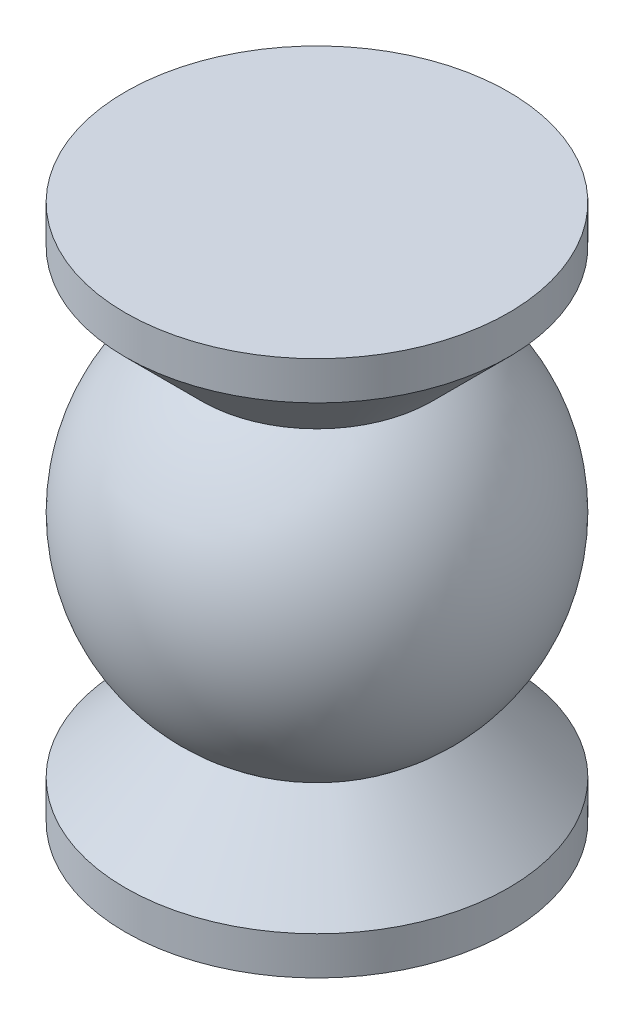
ISO-10303-21;
HEADER;
FILE_DESCRIPTION(('STEP AP214'),'2;1');
FILE_NAME('part.step','',(''),(''),'','','');
FILE_SCHEMA(('AUTOMOTIVE_DESIGN { 1 0 10303 214 1 1 1 1 }'));
ENDSEC;
DATA;
#1=APPLICATION_CONTEXT('core data for automotive mechanical design processes');
#2=APPLICATION_PROTOCOL_DEFINITION('international standard','automotive_design',2000,#1);
#3=PRODUCT_CONTEXT('',#1,'mechanical');
#4=PRODUCT('Part','Part','',(#3));
#5=PRODUCT_RELATED_PRODUCT_CATEGORY('part','',(#4));
#6=PRODUCT_DEFINITION_FORMATION('','',#4);
#7=PRODUCT_DEFINITION_CONTEXT('part definition',#1,'design');
#8=PRODUCT_DEFINITION('design','',#6,#7);
#9=PRODUCT_DEFINITION_SHAPE('','',#8);
#10=(LENGTH_UNIT() NAMED_UNIT(*) SI_UNIT(.MILLI.,.METRE.));
#11=(NAMED_UNIT(*) PLANE_ANGLE_UNIT() SI_UNIT($,.RADIAN.));
#12=(NAMED_UNIT(*) SI_UNIT($,.STERADIAN.) SOLID_ANGLE_UNIT());
#13=UNCERTAINTY_MEASURE_WITH_UNIT(LENGTH_MEASURE(1.E-05),#10,'distance_accuracy_value','');
#14=(GEOMETRIC_REPRESENTATION_CONTEXT(3) GLOBAL_UNCERTAINTY_ASSIGNED_CONTEXT((#13)) GLOBAL_UNIT_ASSIGNED_CONTEXT((#10,
#11,#12)) REPRESENTATION_CONTEXT('',''));
#15=CARTESIAN_POINT('',(0.,0.,0.));
#16=DIRECTION('',(0.,0.,1.));
#17=DIRECTION('',(1.,0.,0.));
#18=AXIS2_PLACEMENT_3D('',#15,#16,#17);
#19=CARTESIAN_POINT('',(0.,35.,0.));
#20=DIRECTION('',(0.,-1.,0.));
#21=DIRECTION('',(0.,0.,-1.));
#22=AXIS2_PLACEMENT_3D('',#19,#20,#21);
#23=PLANE('',#22);
#24=CARTESIAN_POINT('',(0.,35.,0.));
#25=DIRECTION('',(0.,1.,0.));
#26=DIRECTION('',(0.,0.,1.));
#27=AXIS2_PLACEMENT_3D('',#24,#25,#26);
#28=CIRCLE('',#27,25.);
#29=CARTESIAN_POINT('',(0.,35.,25.));
#30=VERTEX_POINT('',#29);
#31=EDGE_CURVE('E10',#30,#30,#28,.T.);
#32=ORIENTED_EDGE('',*,*,#31,.T.);
#33=EDGE_LOOP('',(#32));
#34=FACE_BOUND('',#33,.T.);
#35=ADVANCED_FACE('F41',(#34),#23,.F.);
#36=CARTESIAN_POINT('',(0.,52.3742990344634,0.));
#37=DIRECTION('',(0.,1.,0.));
#38=DIRECTION('',(0.,0.,1.));
#39=AXIS2_PLACEMENT_3D('',#36,#37,#38);
#40=CYLINDRICAL_SURFACE('',#39,25.);
#41=ORIENTED_EDGE('',*,*,#31,.F.);
#42=EDGE_LOOP('',(#41));
#43=FACE_BOUND('',#42,.T.);
#44=CARTESIAN_POINT('',(0.,30.,0.));
#45=DIRECTION('',(0.,1.,0.));
#46=DIRECTION('',(0.,0.,1.));
#47=AXIS2_PLACEMENT_3D('',#44,#45,#46);
#48=CIRCLE('',#47,25.);
#49=CARTESIAN_POINT('',(0.,30.,25.));
#50=VERTEX_POINT('',#49);
#51=EDGE_CURVE('E47',#50,#50,#48,.T.);
#52=ORIENTED_EDGE('',*,*,#51,.T.);
#53=EDGE_LOOP('',(#52));
#54=FACE_BOUND('',#53,.T.);
#55=ADVANCED_FACE('F79',(#43,#54),#40,.T.);
#56=CARTESIAN_POINT('',(0.,20.,0.));
#57=DIRECTION('',(0.,1.,0.));
#58=DIRECTION('',(0.,0.,1.));
#59=AXIS2_PLACEMENT_3D('',#56,#57,#58);
#60=CONICAL_SURFACE('',#59,14.9999999999999,0.785398163397453);
#61=ORIENTED_EDGE('',*,*,#51,.F.);
#62=EDGE_LOOP('',(#61));
#63=FACE_BOUND('',#62,.T.);
#64=CARTESIAN_POINT('',(0.,20.,0.));
#65=DIRECTION('',(0.,1.,0.));
#66=DIRECTION('',(0.,0.,1.));
#67=AXIS2_PLACEMENT_3D('',#64,#65,#66);
#68=CIRCLE('',#67,14.9999999999999);
#69=CARTESIAN_POINT('',(14.9999999999999,20.,0.));
#70=VERTEX_POINT('',#69);
#71=EDGE_CURVE('E51',#70,#70,#68,.T.);
#72=ORIENTED_EDGE('',*,*,#71,.T.);
#73=EDGE_LOOP('',(#72));
#74=FACE_BOUND('',#73,.T.);
#75=ADVANCED_FACE('F83',(#63,#74),#60,.T.);
#76=CARTESIAN_POINT('',(0.,0.,0.));
#77=DIRECTION('',(0.,1.,0.));
#78=DIRECTION('',(1.,0.,0.));
#79=AXIS2_PLACEMENT_3D('',#76,#77,#78);
#80=SPHERICAL_SURFACE('',#79,24.9999999999999);
#81=CARTESIAN_POINT('',(0.,-20.,0.));
#82=DIRECTION('',(0.,1.,0.));
#83=DIRECTION('',(0.,0.,1.));
#84=AXIS2_PLACEMENT_3D('',#81,#82,#83);
#85=CIRCLE('',#84,14.9999999999999);
#86=CARTESIAN_POINT('',(14.9999999999999,-20.,0.));
#87=VERTEX_POINT('',#86);
#88=EDGE_CURVE('E55',#87,#87,#85,.T.);
#89=CARTESIAN_POINT('',(14.9999999999999,20.,0.));
#90=CARTESIAN_POINT('',(15.3863838775749,19.7102331585328,0.));
#91=CARTESIAN_POINT('',(15.7643493042769,19.4092445387064,0.));
#92=CARTESIAN_POINT('',(16.5022218904125,18.785891059142,0.));
#93=CARTESIAN_POINT('',(16.8621290498461,18.4635261994041,0.));
#94=CARTESIAN_POINT('',(17.5626637359226,17.7984875568239,0.));
#95=CARTESIAN_POINT('',(17.9032912625655,17.4558137739817,0.));
#96=CARTESIAN_POINT('',(18.5641263057404,16.751312031891,0.));
#97=CARTESIAN_POINT('',(18.8843338222725,16.3894840726425,0.));
#98=CARTESIAN_POINT('',(19.5032526836537,15.6478878896459,0.));
#99=CARTESIAN_POINT('',(19.8019640285029,15.2681196658977,0.));
#100=CARTESIAN_POINT('',(20.3768877346254,14.4919184892619,0.));
#101=CARTESIAN_POINT('',(20.6531000958987,14.0954855363742,0.));
#102=CARTESIAN_POINT('',(21.1820982609087,13.2872860261715,0.));
#103=CARTESIAN_POINT('',(21.4348840646453,12.8755194688565,0.));
#104=CARTESIAN_POINT('',(21.9161802896365,12.0380354631662,0.));
#105=CARTESIAN_POINT('',(22.144690710891,11.6123180147909,0.));
#106=CARTESIAN_POINT('',(22.5766688391046,10.748361760207,0.));
#107=CARTESIAN_POINT('',(22.7801365460636,10.3101229539983,0.));
#108=CARTESIAN_POINT('',(23.1613460121235,9.42259557021363,0.));
#109=CARTESIAN_POINT('',(23.3390877712243,8.97330699263762,0.));
#110=CARTESIAN_POINT('',(23.6682484928968,8.06518875528102,0.));
#111=CARTESIAN_POINT('',(23.8196674554685,7.60635909550044,0.));
#112=CARTESIAN_POINT('',(24.0956741265361,6.68069942190651,0.));
#113=CARTESIAN_POINT('',(24.2202618350321,6.21386940809315,0.));
#114=CARTESIAN_POINT('',(24.4421876383543,5.27377661927491,0.));
#115=CARTESIAN_POINT('',(24.5395257331807,4.80051384427003,0.));
#116=CARTESIAN_POINT('',(24.706625452501,3.84914472685123,0.));
#117=CARTESIAN_POINT('',(24.776387076995,3.37103838443732,0.));
#118=CARTESIAN_POINT('',(24.8880995994487,2.41158759044098,0.));
#119=CARTESIAN_POINT('',(24.9300504974084,1.93024313885855,0.));
#120=CARTESIAN_POINT('',(24.986000697684,0.96593245818408,0.));
#121=CARTESIAN_POINT('',(24.9999999999999,0.482966229092039,0.));
#122=CARTESIAN_POINT('',(24.9999999999999,-0.482966229092044,0.));
#123=CARTESIAN_POINT('',(24.986000697684,-0.965932458184085,0.));
#124=CARTESIAN_POINT('',(24.9300504974084,-1.93024313885856,0.));
#125=CARTESIAN_POINT('',(24.8880995994487,-2.41158759044099,0.));
#126=CARTESIAN_POINT('',(24.776387076995,-3.37103838443733,0.));
#127=CARTESIAN_POINT('',(24.706625452501,-3.84914472685124,0.));
#128=CARTESIAN_POINT('',(24.5395257331807,-4.80051384427003,0.));
#129=CARTESIAN_POINT('',(24.4421876383543,-5.27377661927492,0.));
#130=CARTESIAN_POINT('',(24.2202618350321,-6.21386940809316,0.));
#131=CARTESIAN_POINT('',(24.0956741265361,-6.68069942190651,0.));
#132=CARTESIAN_POINT('',(23.8196674554685,-7.60635909550045,0.));
#133=CARTESIAN_POINT('',(23.6682484928968,-8.06518875528103,0.));
#134=CARTESIAN_POINT('',(23.3390877712243,-8.97330699263762,0.));
#135=CARTESIAN_POINT('',(23.1613460121235,-9.42259557021364,0.));
#136=CARTESIAN_POINT('',(22.7801365460636,-10.3101229539983,0.));
#137=CARTESIAN_POINT('',(22.5766688391046,-10.748361760207,0.));
#138=CARTESIAN_POINT('',(22.144690710891,-11.6123180147909,0.));
#139=CARTESIAN_POINT('',(21.9161802896365,-12.0380354631662,0.));
#140=CARTESIAN_POINT('',(21.4348840646453,-12.8755194688565,0.));
#141=CARTESIAN_POINT('',(21.1820982609087,-13.2872860261715,0.));
#142=CARTESIAN_POINT('',(20.6531000958987,-14.0954855363742,0.));
#143=CARTESIAN_POINT('',(20.3768877346254,-14.4919184892619,0.));
#144=CARTESIAN_POINT('',(19.8019640285028,-15.2681196658977,0.));
#145=CARTESIAN_POINT('',(19.5032526836537,-15.6478878896459,0.));
#146=CARTESIAN_POINT('',(18.8843338222725,-16.3894840726425,0.));
#147=CARTESIAN_POINT('',(18.5641263057404,-16.751312031891,0.));
#148=CARTESIAN_POINT('',(17.9032912625655,-17.4558137739817,0.));
#149=CARTESIAN_POINT('',(17.5626637359226,-17.7984875568239,0.));
#150=CARTESIAN_POINT('',(16.8621290498461,-18.4635261994041,0.));
#151=CARTESIAN_POINT('',(16.5022218904125,-18.785891059142,0.));
#152=CARTESIAN_POINT('',(15.7643493042769,-19.4092445387064,0.));
#153=CARTESIAN_POINT('',(15.3863838775749,-19.7102331585329,0.));
#154=CARTESIAN_POINT('',(14.9999999999999,-20.,0.));
#155=B_SPLINE_CURVE_WITH_KNOTS('',3,(#89,#90,#91,#92,#93,#94,#95,#96,#97,#98,#99,#100,#101,#102,
#103,#104,#105,#106,#107,#108,#109,#110,#111,#112,#113,#114,#115,#116,#117,#118,#119,#120,#121,
#122,#123,#124,#125,#126,#127,#128,#129,#130,#131,#132,#133,#134,#135,#136,#137,#138,#139,#140,
#141,#142,#143,#144,#145,#146,#147,#148,#149,#150,#151,#152,#153,#154),.UNSPECIFIED.,.F.,.F.,(4,
2,2,2,2,2,2,2,2,2,2,2,2,2,2,2,2,2,2,2,2,2,2,2,2,2,2,2,2,2,2,2,4),(0.,1.4486960076868,
2.8973920153736,4.34608802306039,5.7947840307472,7.243480038434,8.69217604612079,
10.1408720538076,11.5895680614944,13.0382640691812,14.486960076868,15.9356560845548,
17.3843520922416,18.8330480999284,20.2817441076152,21.730440115302,23.1791361229888,
24.6278321306756,26.0765281383624,27.5252241460492,28.973920153736,30.4226161614228,
31.8713121691096,33.3200081767964,34.7687041844831,36.2174001921699,37.6660961998567,
39.1147922075435,40.5634882152304,42.0121842229171,43.4608802306039,44.9095762382907,
46.3582722459775),.UNSPECIFIED.);
#156=EDGE_CURVE('BSEAM88',#70,#87,#155,.T.);
#157=ORIENTED_EDGE('',*,*,#71,.F.);
#158=ORIENTED_EDGE('',*,*,#88,.T.);
#159=ORIENTED_EDGE('',*,*,#156,.T.);
#160=ORIENTED_EDGE('',*,*,#156,.F.);
#161=EDGE_LOOP('',(#157,#159,#158,#160));
#162=FACE_BOUND('',#161,.T.);
#163=ADVANCED_FACE('F88',(#162),#80,.T.);
#164=CARTESIAN_POINT('',(0.,-30.,0.));
#165=DIRECTION('',(0.,-1.,0.));
#166=DIRECTION('',(0.,0.,-1.));
#167=AXIS2_PLACEMENT_3D('',#164,#165,#166);
#168=CONICAL_SURFACE('',#167,25.,0.785398163397453);
#169=ORIENTED_EDGE('',*,*,#88,.F.);
#170=EDGE_LOOP('',(#169));
#171=FACE_BOUND('',#170,.T.);
#172=CARTESIAN_POINT('',(0.,-30.,0.));
#173=DIRECTION('',(0.,1.,0.));
#174=DIRECTION('',(0.,0.,1.));
#175=AXIS2_PLACEMENT_3D('',#172,#173,#174);
#176=CIRCLE('',#175,25.);
#177=CARTESIAN_POINT('',(0.,-30.,25.));
#178=VERTEX_POINT('',#177);
#179=EDGE_CURVE('E60',#178,#178,#176,.T.);
#180=ORIENTED_EDGE('',*,*,#179,.T.);
#181=EDGE_LOOP('',(#180));
#182=FACE_BOUND('',#181,.T.);
#183=ADVANCED_FACE('F75',(#171,#182),#168,.T.);
#184=CARTESIAN_POINT('',(0.,52.3742990344634,0.));
#185=DIRECTION('',(0.,1.,0.));
#186=DIRECTION('',(0.,0.,1.));
#187=AXIS2_PLACEMENT_3D('',#184,#185,#186);
#188=CYLINDRICAL_SURFACE('',#187,25.);
#189=ORIENTED_EDGE('',*,*,#179,.F.);
#190=EDGE_LOOP('',(#189));
#191=FACE_BOUND('',#190,.T.);
#192=CARTESIAN_POINT('',(0.,-35.,0.));
#193=DIRECTION('',(0.,1.,0.));
#194=DIRECTION('',(0.,0.,1.));
#195=AXIS2_PLACEMENT_3D('',#192,#193,#194);
#196=CIRCLE('',#195,25.);
#197=CARTESIAN_POINT('',(0.,-35.,25.));
#198=VERTEX_POINT('',#197);
#199=EDGE_CURVE('E63',#198,#198,#196,.T.);
#200=ORIENTED_EDGE('',*,*,#199,.T.);
#201=EDGE_LOOP('',(#200));
#202=FACE_BOUND('',#201,.T.);
#203=ADVANCED_FACE('F67',(#191,#202),#188,.T.);
#204=CARTESIAN_POINT('',(0.,-35.,0.));
#205=DIRECTION('',(0.,1.,0.));
#206=DIRECTION('',(0.,0.,1.));
#207=AXIS2_PLACEMENT_3D('',#204,#205,#206);
#208=PLANE('',#207);
#209=ORIENTED_EDGE('',*,*,#199,.F.);
#210=EDGE_LOOP('',(#209));
#211=FACE_BOUND('',#210,.T.);
#212=ADVANCED_FACE('F69',(#211),#208,.F.);
#213=CLOSED_SHELL('',(#35,#55,#75,#163,#183,#203,#212));
#214=MANIFOLD_SOLID_BREP('B2',#213);
#215=ADVANCED_BREP_SHAPE_REPRESENTATION('',(#18,#214),#14);
#216=SHAPE_DEFINITION_REPRESENTATION(#9,#215);
ENDSEC;
END-ISO-10303-21;
